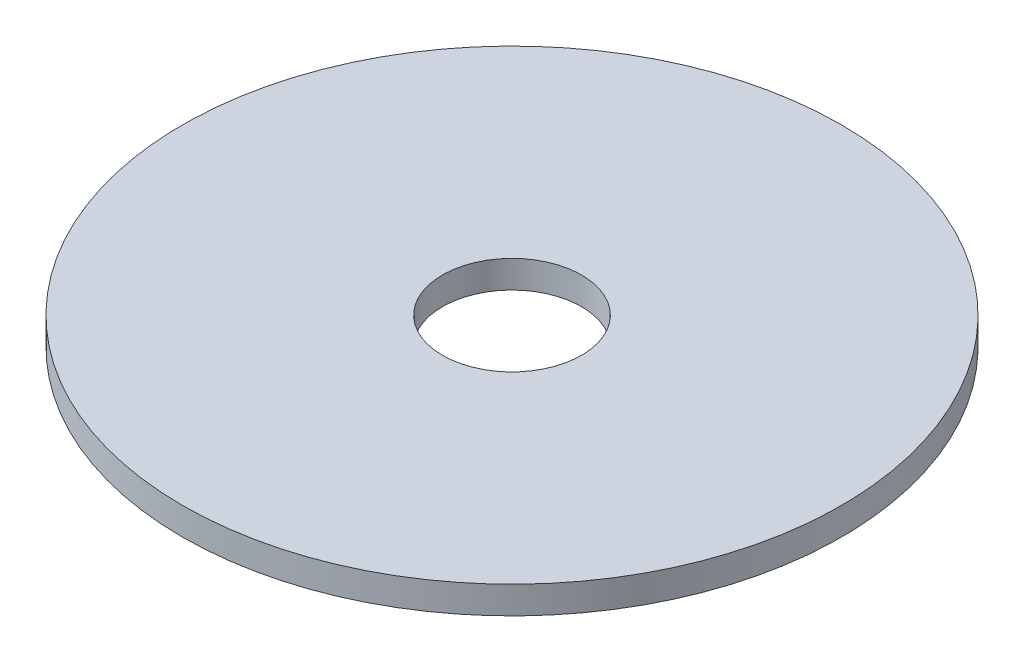
ISO-10303-21;
HEADER;
FILE_DESCRIPTION(('STEP AP214'),'2;1');
FILE_NAME('part.step','',(''),(''),'','','');
FILE_SCHEMA(('AUTOMOTIVE_DESIGN { 1 0 10303 214 1 1 1 1 }'));
ENDSEC;
DATA;
#1=APPLICATION_CONTEXT('core data for automotive mechanical design processes');
#2=APPLICATION_PROTOCOL_DEFINITION('international standard','automotive_design',2000,#1);
#3=PRODUCT_CONTEXT('',#1,'mechanical');
#4=PRODUCT('Part','Part','',(#3));
#5=PRODUCT_RELATED_PRODUCT_CATEGORY('part','',(#4));
#6=PRODUCT_DEFINITION_FORMATION('','',#4);
#7=PRODUCT_DEFINITION_CONTEXT('part definition',#1,'design');
#8=PRODUCT_DEFINITION('design','',#6,#7);
#9=PRODUCT_DEFINITION_SHAPE('','',#8);
#10=(LENGTH_UNIT() NAMED_UNIT(*) SI_UNIT(.MILLI.,.METRE.));
#11=(NAMED_UNIT(*) PLANE_ANGLE_UNIT() SI_UNIT($,.RADIAN.));
#12=(NAMED_UNIT(*) SI_UNIT($,.STERADIAN.) SOLID_ANGLE_UNIT());
#13=UNCERTAINTY_MEASURE_WITH_UNIT(LENGTH_MEASURE(1.E-05),#10,'distance_accuracy_value','');
#14=(GEOMETRIC_REPRESENTATION_CONTEXT(3) GLOBAL_UNCERTAINTY_ASSIGNED_CONTEXT((#13)) GLOBAL_UNIT_ASSIGNED_CONTEXT((#10,
#11,#12)) REPRESENTATION_CONTEXT('',''));
#15=CARTESIAN_POINT('',(0.,0.,0.));
#16=DIRECTION('',(0.,0.,1.));
#17=DIRECTION('',(1.,0.,0.));
#18=AXIS2_PLACEMENT_3D('',#15,#16,#17);
#19=CARTESIAN_POINT('',(0.,3.,0.));
#20=DIRECTION('',(0.,1.,0.));
#21=DIRECTION('',(0.,0.,1.));
#22=AXIS2_PLACEMENT_3D('',#19,#20,#21);
#23=PLANE('',#22);
#24=CARTESIAN_POINT('',(0.,3.,0.));
#25=DIRECTION('',(0.,1.,0.));
#26=DIRECTION('',(0.,0.,1.));
#27=AXIS2_PLACEMENT_3D('',#24,#25,#26);
#28=CIRCLE('',#27,36.);
#29=CARTESIAN_POINT('',(0.,3.,36.));
#30=VERTEX_POINT('',#29);
#31=EDGE_CURVE('E10',#30,#30,#28,.T.);
#32=ORIENTED_EDGE('',*,*,#31,.T.);
#33=EDGE_LOOP('',(#32));
#34=FACE_BOUND('',#33,.T.);
#35=CARTESIAN_POINT('',(0.,3.,0.));
#36=DIRECTION('',(0.,1.,0.));
#37=DIRECTION('',(0.,0.,1.));
#38=AXIS2_PLACEMENT_3D('',#35,#36,#37);
#39=CIRCLE('',#38,7.6);
#40=CARTESIAN_POINT('',(0.,3.,7.6));
#41=VERTEX_POINT('',#40);
#42=EDGE_CURVE('E40',#41,#41,#39,.T.);
#43=ORIENTED_EDGE('',*,*,#42,.F.);
#44=EDGE_LOOP('',(#43));
#45=FACE_BOUND('',#44,.T.);
#46=ADVANCED_FACE('F29',(#34,#45),#23,.T.);
#47=CARTESIAN_POINT('',(0.,0.,0.));
#48=DIRECTION('',(0.,1.,0.));
#49=DIRECTION('',(0.,0.,1.));
#50=AXIS2_PLACEMENT_3D('',#47,#48,#49);
#51=PLANE('',#50);
#52=CARTESIAN_POINT('',(0.,0.,0.));
#53=DIRECTION('',(0.,1.,0.));
#54=DIRECTION('',(0.,0.,1.));
#55=AXIS2_PLACEMENT_3D('',#52,#53,#54);
#56=CIRCLE('',#55,36.);
#57=CARTESIAN_POINT('',(0.,0.,36.));
#58=VERTEX_POINT('',#57);
#59=EDGE_CURVE('E33',#58,#58,#56,.T.);
#60=ORIENTED_EDGE('',*,*,#59,.F.);
#61=EDGE_LOOP('',(#60));
#62=FACE_BOUND('',#61,.T.);
#63=CARTESIAN_POINT('',(0.,0.,0.));
#64=DIRECTION('',(0.,1.,0.));
#65=DIRECTION('',(0.,0.,1.));
#66=AXIS2_PLACEMENT_3D('',#63,#64,#65);
#67=CIRCLE('',#66,7.6);
#68=CARTESIAN_POINT('',(0.,0.,7.6));
#69=VERTEX_POINT('',#68);
#70=EDGE_CURVE('E42',#69,#69,#67,.T.);
#71=ORIENTED_EDGE('',*,*,#70,.T.);
#72=EDGE_LOOP('',(#71));
#73=FACE_BOUND('',#72,.T.);
#74=ADVANCED_FACE('F52',(#62,#73),#51,.F.);
#75=CARTESIAN_POINT('',(0.,3.,0.));
#76=DIRECTION('',(0.,-1.,0.));
#77=DIRECTION('',(0.,0.,-1.));
#78=AXIS2_PLACEMENT_3D('',#75,#76,#77);
#79=CYLINDRICAL_SURFACE('',#78,36.);
#80=ORIENTED_EDGE('',*,*,#31,.F.);
#81=EDGE_LOOP('',(#80));
#82=FACE_BOUND('',#81,.T.);
#83=ORIENTED_EDGE('',*,*,#59,.T.);
#84=EDGE_LOOP('',(#83));
#85=FACE_BOUND('',#84,.T.);
#86=ADVANCED_FACE('F31',(#82,#85),#79,.T.);
#87=CARTESIAN_POINT('',(0.,3.,0.));
#88=DIRECTION('',(0.,-1.,0.));
#89=DIRECTION('',(0.,0.,-1.));
#90=AXIS2_PLACEMENT_3D('',#87,#88,#89);
#91=CYLINDRICAL_SURFACE('',#90,7.6);
#92=ORIENTED_EDGE('',*,*,#42,.T.);
#93=EDGE_LOOP('',(#92));
#94=FACE_BOUND('',#93,.T.);
#95=ORIENTED_EDGE('',*,*,#70,.F.);
#96=EDGE_LOOP('',(#95));
#97=FACE_BOUND('',#96,.T.);
#98=ADVANCED_FACE('F48',(#94,#97),#91,.F.);
#99=CLOSED_SHELL('',(#46,#74,#86,#98));
#100=MANIFOLD_SOLID_BREP('B2',#99);
#101=ADVANCED_BREP_SHAPE_REPRESENTATION('',(#18,#100),#14);
#102=SHAPE_DEFINITION_REPRESENTATION(#9,#101);
ENDSEC;
END-ISO-10303-21;
